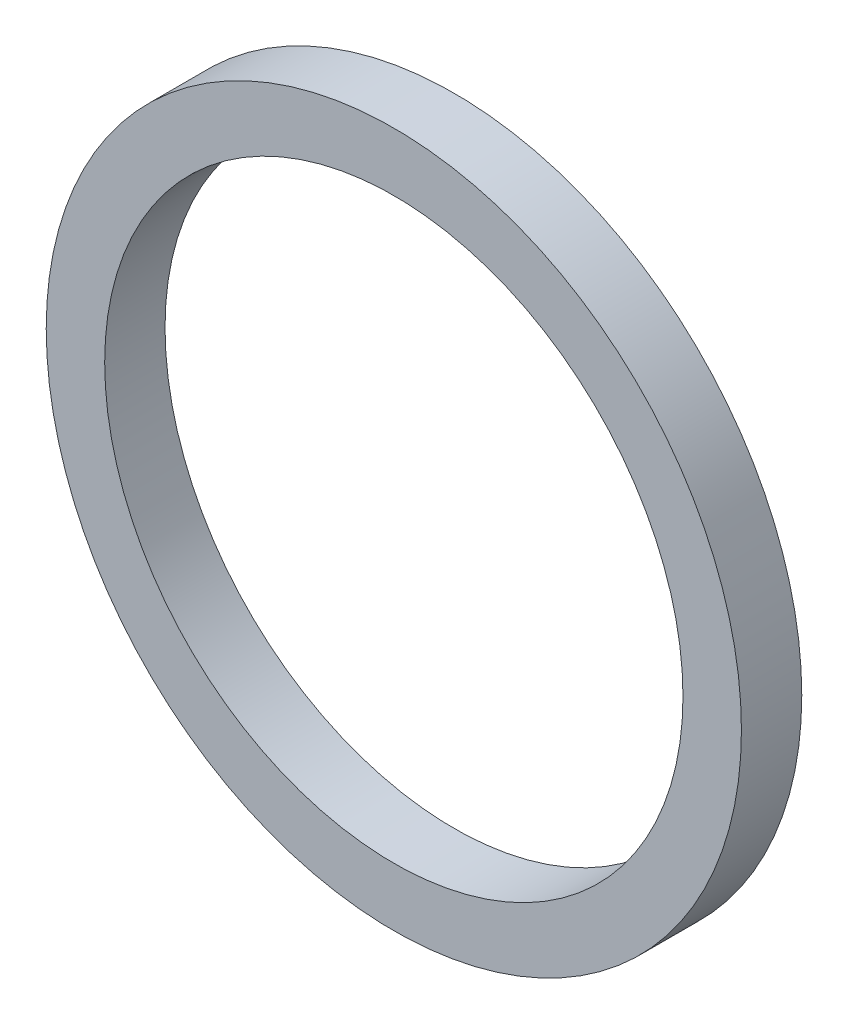
ISO-10303-21;
HEADER;
FILE_DESCRIPTION(('STEP AP214'),'2;1');
FILE_NAME('part.step','',(''),(''),'','','');
FILE_SCHEMA(('AUTOMOTIVE_DESIGN { 1 0 10303 214 1 1 1 1 }'));
ENDSEC;
DATA;
#1=APPLICATION_CONTEXT('core data for automotive mechanical design processes');
#2=APPLICATION_PROTOCOL_DEFINITION('international standard','automotive_design',2000,#1);
#3=PRODUCT_CONTEXT('',#1,'mechanical');
#4=PRODUCT('Part','Part','',(#3));
#5=PRODUCT_RELATED_PRODUCT_CATEGORY('part','',(#4));
#6=PRODUCT_DEFINITION_FORMATION('','',#4);
#7=PRODUCT_DEFINITION_CONTEXT('part definition',#1,'design');
#8=PRODUCT_DEFINITION('design','',#6,#7);
#9=PRODUCT_DEFINITION_SHAPE('','',#8);
#10=(LENGTH_UNIT() NAMED_UNIT(*) SI_UNIT(.MILLI.,.METRE.));
#11=(NAMED_UNIT(*) PLANE_ANGLE_UNIT() SI_UNIT($,.RADIAN.));
#12=(NAMED_UNIT(*) SI_UNIT($,.STERADIAN.) SOLID_ANGLE_UNIT());
#13=UNCERTAINTY_MEASURE_WITH_UNIT(LENGTH_MEASURE(1.E-05),#10,'distance_accuracy_value','');
#14=(GEOMETRIC_REPRESENTATION_CONTEXT(3) GLOBAL_UNCERTAINTY_ASSIGNED_CONTEXT((#13)) GLOBAL_UNIT_ASSIGNED_CONTEXT((#10,
#11,#12)) REPRESENTATION_CONTEXT('',''));
#15=CARTESIAN_POINT('',(0.,0.,0.));
#16=DIRECTION('',(0.,0.,1.));
#17=DIRECTION('',(1.,0.,0.));
#18=AXIS2_PLACEMENT_3D('',#15,#16,#17);
#19=CARTESIAN_POINT('',(0.,0.,12.2));
#20=DIRECTION('',(0.,0.,1.));
#21=DIRECTION('',(1.,0.,0.));
#22=AXIS2_PLACEMENT_3D('',#19,#20,#21);
#23=PLANE('',#22);
#24=CARTESIAN_POINT('',(0.,0.,12.2));
#25=DIRECTION('',(0.,0.,1.));
#26=DIRECTION('',(1.,0.,0.));
#27=AXIS2_PLACEMENT_3D('',#24,#25,#26);
#28=CIRCLE('',#27,27.65);
#29=CARTESIAN_POINT('',(27.65,0.,12.2));
#30=VERTEX_POINT('',#29);
#31=EDGE_CURVE('E10',#30,#30,#28,.T.);
#32=ORIENTED_EDGE('',*,*,#31,.T.);
#33=EDGE_LOOP('',(#32));
#34=FACE_BOUND('',#33,.T.);
#35=CARTESIAN_POINT('',(0.,0.,12.2));
#36=DIRECTION('',(0.,0.,1.));
#37=DIRECTION('',(1.,0.,0.));
#38=AXIS2_PLACEMENT_3D('',#35,#36,#37);
#39=CIRCLE('',#38,23.);
#40=CARTESIAN_POINT('',(23.,0.,12.2));
#41=VERTEX_POINT('',#40);
#42=EDGE_CURVE('E42',#41,#41,#39,.T.);
#43=ORIENTED_EDGE('',*,*,#42,.F.);
#44=EDGE_LOOP('',(#43));
#45=FACE_BOUND('',#44,.T.);
#46=ADVANCED_FACE('F31',(#34,#45),#23,.T.);
#47=CARTESIAN_POINT('',(0.,0.,7.4));
#48=DIRECTION('',(0.,0.,1.));
#49=DIRECTION('',(1.,0.,0.));
#50=AXIS2_PLACEMENT_3D('',#47,#48,#49);
#51=PLANE('',#50);
#52=CARTESIAN_POINT('',(0.,0.,7.4));
#53=DIRECTION('',(0.,0.,1.));
#54=DIRECTION('',(1.,0.,0.));
#55=AXIS2_PLACEMENT_3D('',#52,#53,#54);
#56=CIRCLE('',#55,27.65);
#57=CARTESIAN_POINT('',(27.65,0.,7.4));
#58=VERTEX_POINT('',#57);
#59=EDGE_CURVE('E35',#58,#58,#56,.T.);
#60=ORIENTED_EDGE('',*,*,#59,.F.);
#61=EDGE_LOOP('',(#60));
#62=FACE_BOUND('',#61,.T.);
#63=CARTESIAN_POINT('',(0.,0.,7.4));
#64=DIRECTION('',(0.,0.,1.));
#65=DIRECTION('',(1.,0.,0.));
#66=AXIS2_PLACEMENT_3D('',#63,#64,#65);
#67=CIRCLE('',#66,23.);
#68=CARTESIAN_POINT('',(23.,0.,7.4));
#69=VERTEX_POINT('',#68);
#70=EDGE_CURVE('E44',#69,#69,#67,.T.);
#71=ORIENTED_EDGE('',*,*,#70,.T.);
#72=EDGE_LOOP('',(#71));
#73=FACE_BOUND('',#72,.T.);
#74=ADVANCED_FACE('F54',(#62,#73),#51,.F.);
#75=CARTESIAN_POINT('',(0.,0.,12.2));
#76=DIRECTION('',(0.,0.,-1.));
#77=DIRECTION('',(-1.,0.,0.));
#78=AXIS2_PLACEMENT_3D('',#75,#76,#77);
#79=CYLINDRICAL_SURFACE('',#78,27.65);
#80=ORIENTED_EDGE('',*,*,#31,.F.);
#81=EDGE_LOOP('',(#80));
#82=FACE_BOUND('',#81,.T.);
#83=ORIENTED_EDGE('',*,*,#59,.T.);
#84=EDGE_LOOP('',(#83));
#85=FACE_BOUND('',#84,.T.);
#86=ADVANCED_FACE('F33',(#82,#85),#79,.T.);
#87=CARTESIAN_POINT('',(0.,0.,12.2));
#88=DIRECTION('',(0.,0.,-1.));
#89=DIRECTION('',(-1.,0.,0.));
#90=AXIS2_PLACEMENT_3D('',#87,#88,#89);
#91=CYLINDRICAL_SURFACE('',#90,23.);
#92=ORIENTED_EDGE('',*,*,#42,.T.);
#93=EDGE_LOOP('',(#92));
#94=FACE_BOUND('',#93,.T.);
#95=ORIENTED_EDGE('',*,*,#70,.F.);
#96=EDGE_LOOP('',(#95));
#97=FACE_BOUND('',#96,.T.);
#98=ADVANCED_FACE('F50',(#94,#97),#91,.F.);
#99=CLOSED_SHELL('',(#46,#74,#86,#98));
#100=MANIFOLD_SOLID_BREP('B2',#99);
#101=ADVANCED_BREP_SHAPE_REPRESENTATION('',(#18,#100),#14);
#102=SHAPE_DEFINITION_REPRESENTATION(#9,#101);
ENDSEC;
END-ISO-10303-21;
